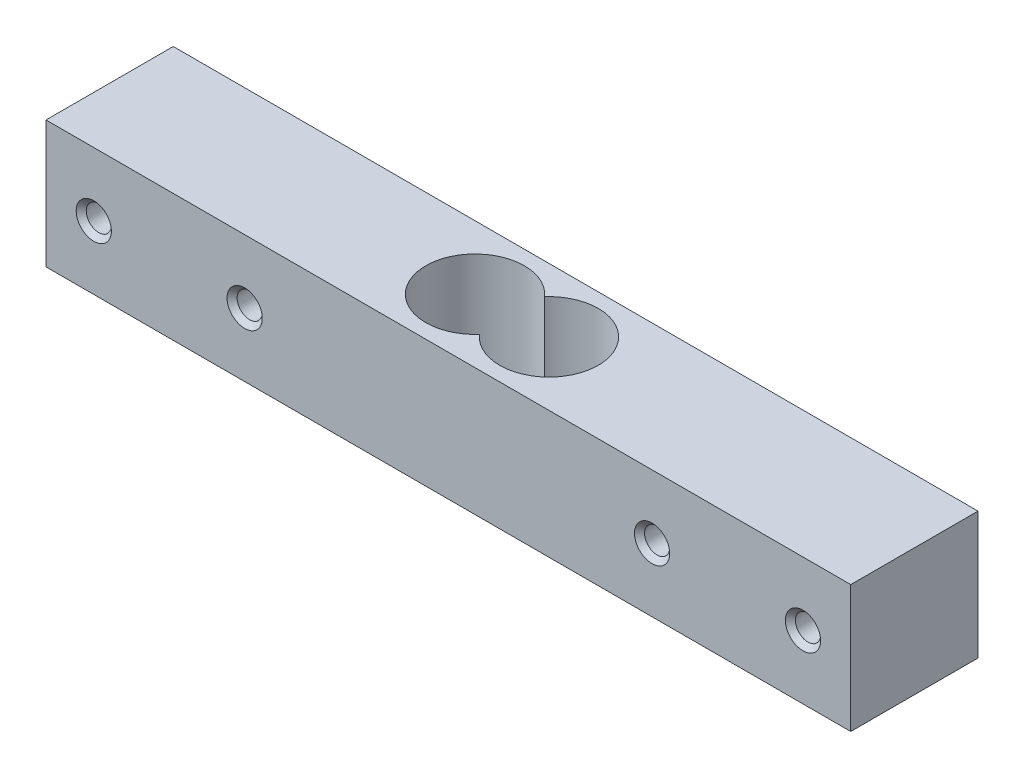
ISO-10303-21;
HEADER;
FILE_DESCRIPTION(('STEP AP214'),'2;1');
FILE_NAME('part.step','',(''),(''),'','','');
FILE_SCHEMA(('AUTOMOTIVE_DESIGN { 1 0 10303 214 1 1 1 1 }'));
ENDSEC;
DATA;
#1=APPLICATION_CONTEXT('core data for automotive mechanical design processes');
#2=APPLICATION_PROTOCOL_DEFINITION('international standard','automotive_design',2000,#1);
#3=PRODUCT_CONTEXT('',#1,'mechanical');
#4=PRODUCT('Part','Part','',(#3));
#5=PRODUCT_RELATED_PRODUCT_CATEGORY('part','',(#4));
#6=PRODUCT_DEFINITION_FORMATION('','',#4);
#7=PRODUCT_DEFINITION_CONTEXT('part definition',#1,'design');
#8=PRODUCT_DEFINITION('design','',#6,#7);
#9=PRODUCT_DEFINITION_SHAPE('','',#8);
#10=(LENGTH_UNIT() NAMED_UNIT(*) SI_UNIT(.MILLI.,.METRE.));
#11=(NAMED_UNIT(*) PLANE_ANGLE_UNIT() SI_UNIT($,.RADIAN.));
#12=(NAMED_UNIT(*) SI_UNIT($,.STERADIAN.) SOLID_ANGLE_UNIT());
#13=UNCERTAINTY_MEASURE_WITH_UNIT(LENGTH_MEASURE(1.E-05),#10,'distance_accuracy_value','');
#14=(GEOMETRIC_REPRESENTATION_CONTEXT(3) GLOBAL_UNCERTAINTY_ASSIGNED_CONTEXT((#13)) GLOBAL_UNIT_ASSIGNED_CONTEXT((#10,
#11,#12)) REPRESENTATION_CONTEXT('',''));
#15=CARTESIAN_POINT('',(0.,0.,0.));
#16=DIRECTION('',(0.,0.,1.));
#17=DIRECTION('',(1.,0.,0.));
#18=AXIS2_PLACEMENT_3D('',#15,#16,#17);
#19=CARTESIAN_POINT('',(0.,6.325,6.325));
#20=DIRECTION('',(0.,0.,-1.));
#21=DIRECTION('',(-1.,0.,0.));
#22=AXIS2_PLACEMENT_3D('',#19,#20,#21);
#23=PLANE('',#22);
#24=CARTESIAN_POINT('',(-35.25,0.,6.325));
#25=DIRECTION('',(0.,0.,-1.));
#26=DIRECTION('',(-1.,0.,0.));
#27=AXIS2_PLACEMENT_3D('',#24,#25,#26);
#28=CIRCLE('',#27,1.74999999999999);
#29=CARTESIAN_POINT('',(-37.,0.,6.325));
#30=VERTEX_POINT('',#29);
#31=EDGE_CURVE('E232',#30,#30,#28,.T.);
#32=ORIENTED_EDGE('',*,*,#31,.T.);
#33=EDGE_LOOP('',(#32));
#34=FACE_BOUND('',#33,.T.);
#35=CARTESIAN_POINT('',(-20.25,0.,6.325));
#36=DIRECTION('',(0.,0.,-1.));
#37=DIRECTION('',(-1.,0.,0.));
#38=AXIS2_PLACEMENT_3D('',#35,#36,#37);
#39=CIRCLE('',#38,1.75);
#40=CARTESIAN_POINT('',(-22.,0.,6.325));
#41=VERTEX_POINT('',#40);
#42=EDGE_CURVE('E244',#41,#41,#39,.T.);
#43=ORIENTED_EDGE('',*,*,#42,.T.);
#44=EDGE_LOOP('',(#43));
#45=FACE_BOUND('',#44,.T.);
#46=CARTESIAN_POINT('',(20.25,0.,6.325));
#47=DIRECTION('',(0.,0.,-1.));
#48=DIRECTION('',(-1.,0.,0.));
#49=AXIS2_PLACEMENT_3D('',#46,#47,#48);
#50=CIRCLE('',#49,1.75);
#51=CARTESIAN_POINT('',(18.5,0.,6.325));
#52=VERTEX_POINT('',#51);
#53=EDGE_CURVE('E257',#52,#52,#50,.T.);
#54=ORIENTED_EDGE('',*,*,#53,.T.);
#55=EDGE_LOOP('',(#54));
#56=FACE_BOUND('',#55,.T.);
#57=CARTESIAN_POINT('',(35.25,0.,6.325));
#58=DIRECTION('',(0.,0.,-1.));
#59=DIRECTION('',(-1.,0.,0.));
#60=AXIS2_PLACEMENT_3D('',#57,#58,#59);
#61=CIRCLE('',#60,1.74999999999999);
#62=CARTESIAN_POINT('',(33.5,0.,6.325));
#63=VERTEX_POINT('',#62);
#64=EDGE_CURVE('E212',#63,#63,#61,.T.);
#65=ORIENTED_EDGE('',*,*,#64,.T.);
#66=EDGE_LOOP('',(#65));
#67=FACE_BOUND('',#66,.T.);
#68=DIRECTION('',(1.,0.,0.));
#69=VECTOR('',#68,1.);
#70=CARTESIAN_POINT('',(0.,-6.325,6.325));
#71=LINE('',#70,#69);
#72=CARTESIAN_POINT('',(-40.,-6.325,6.325));
#73=VERTEX_POINT('',#72);
#74=CARTESIAN_POINT('',(40.,-6.325,6.325));
#75=VERTEX_POINT('',#74);
#76=EDGE_CURVE('E138',#73,#75,#71,.T.);
#77=ORIENTED_EDGE('',*,*,#76,.T.);
#78=DIRECTION('',(0.,-1.,0.));
#79=VECTOR('',#78,1.);
#80=CARTESIAN_POINT('',(40.,6.325,6.325));
#81=LINE('',#80,#79);
#82=CARTESIAN_POINT('',(40.,6.325,6.325));
#83=VERTEX_POINT('',#82);
#84=EDGE_CURVE('E11',#83,#75,#81,.T.);
#85=ORIENTED_EDGE('',*,*,#84,.F.);
#86=DIRECTION('',(1.,0.,0.));
#87=VECTOR('',#86,1.);
#88=CARTESIAN_POINT('',(0.,6.325,6.325));
#89=LINE('',#88,#87);
#90=CARTESIAN_POINT('',(-40.,6.325,6.325));
#91=VERTEX_POINT('',#90);
#92=EDGE_CURVE('E108',#91,#83,#89,.T.);
#93=ORIENTED_EDGE('',*,*,#92,.F.);
#94=DIRECTION('',(0.,-1.,0.));
#95=VECTOR('',#94,1.);
#96=CARTESIAN_POINT('',(-40.,6.325,6.325));
#97=LINE('',#96,#95);
#98=EDGE_CURVE('E60',#91,#73,#97,.T.);
#99=ORIENTED_EDGE('',*,*,#98,.T.);
#100=EDGE_LOOP('',(#77,#85,#93,#99));
#101=FACE_BOUND('',#100,.T.);
#102=ADVANCED_FACE('F40',(#34,#45,#56,#67,#101),#23,.F.);
#103=CARTESIAN_POINT('',(40.,6.325,0.));
#104=DIRECTION('',(-1.,0.,0.));
#105=DIRECTION('',(0.,0.,1.));
#106=AXIS2_PLACEMENT_3D('',#103,#104,#105);
#107=PLANE('',#106);
#108=DIRECTION('',(0.,0.,-1.));
#109=VECTOR('',#108,1.);
#110=CARTESIAN_POINT('',(40.,-6.325,0.));
#111=LINE('',#110,#109);
#112=CARTESIAN_POINT('',(40.,-6.325,-6.325));
#113=VERTEX_POINT('',#112);
#114=EDGE_CURVE('E115',#75,#113,#111,.T.);
#115=ORIENTED_EDGE('',*,*,#114,.T.);
#116=DIRECTION('',(0.,-1.,0.));
#117=VECTOR('',#116,1.);
#118=CARTESIAN_POINT('',(40.,6.325,-6.325));
#119=LINE('',#118,#117);
#120=CARTESIAN_POINT('',(40.,6.325,-6.325));
#121=VERTEX_POINT('',#120);
#122=EDGE_CURVE('E51',#121,#113,#119,.T.);
#123=ORIENTED_EDGE('',*,*,#122,.F.);
#124=DIRECTION('',(0.,0.,-1.));
#125=VECTOR('',#124,1.);
#126=CARTESIAN_POINT('',(40.,6.325,0.));
#127=LINE('',#126,#125);
#128=EDGE_CURVE('E102',#83,#121,#127,.T.);
#129=ORIENTED_EDGE('',*,*,#128,.F.);
#130=ORIENTED_EDGE('',*,*,#84,.T.);
#131=EDGE_LOOP('',(#115,#123,#129,#130));
#132=FACE_BOUND('',#131,.T.);
#133=ADVANCED_FACE('F114',(#132),#107,.F.);
#134=CARTESIAN_POINT('',(0.,6.325,-6.325));
#135=DIRECTION('',(0.,0.,-1.));
#136=DIRECTION('',(-1.,0.,0.));
#137=AXIS2_PLACEMENT_3D('',#134,#135,#136);
#138=PLANE('',#137);
#139=CARTESIAN_POINT('',(-35.25,0.,-6.325));
#140=DIRECTION('',(0.,0.,-1.));
#141=DIRECTION('',(-1.,0.,0.));
#142=AXIS2_PLACEMENT_3D('',#139,#140,#141);
#143=CIRCLE('',#142,1.75);
#144=CARTESIAN_POINT('',(-37.,0.,-6.325));
#145=VERTEX_POINT('',#144);
#146=EDGE_CURVE('E197',#145,#145,#143,.T.);
#147=ORIENTED_EDGE('',*,*,#146,.F.);
#148=EDGE_LOOP('',(#147));
#149=FACE_BOUND('',#148,.T.);
#150=CARTESIAN_POINT('',(-20.25,0.,-6.325));
#151=DIRECTION('',(0.,0.,-1.));
#152=DIRECTION('',(-1.,0.,0.));
#153=AXIS2_PLACEMENT_3D('',#150,#151,#152);
#154=CIRCLE('',#153,1.75);
#155=CARTESIAN_POINT('',(-22.,0.,-6.325));
#156=VERTEX_POINT('',#155);
#157=EDGE_CURVE('E201',#156,#156,#154,.T.);
#158=ORIENTED_EDGE('',*,*,#157,.F.);
#159=EDGE_LOOP('',(#158));
#160=FACE_BOUND('',#159,.T.);
#161=CARTESIAN_POINT('',(20.25,0.,-6.325));
#162=DIRECTION('',(0.,0.,-1.));
#163=DIRECTION('',(-1.,0.,0.));
#164=AXIS2_PLACEMENT_3D('',#161,#162,#163);
#165=CIRCLE('',#164,1.75);
#166=CARTESIAN_POINT('',(18.5,0.,-6.325));
#167=VERTEX_POINT('',#166);
#168=EDGE_CURVE('E205',#167,#167,#165,.T.);
#169=ORIENTED_EDGE('',*,*,#168,.F.);
#170=EDGE_LOOP('',(#169));
#171=FACE_BOUND('',#170,.T.);
#172=CARTESIAN_POINT('',(35.25,0.,-6.325));
#173=DIRECTION('',(0.,0.,-1.));
#174=DIRECTION('',(-1.,0.,0.));
#175=AXIS2_PLACEMENT_3D('',#172,#173,#174);
#176=CIRCLE('',#175,1.75);
#177=CARTESIAN_POINT('',(33.5,0.,-6.325));
#178=VERTEX_POINT('',#177);
#179=EDGE_CURVE('E208',#178,#178,#176,.T.);
#180=ORIENTED_EDGE('',*,*,#179,.F.);
#181=EDGE_LOOP('',(#180));
#182=FACE_BOUND('',#181,.T.);
#183=DIRECTION('',(1.,0.,0.));
#184=VECTOR('',#183,1.);
#185=CARTESIAN_POINT('',(0.,-6.325,-6.325));
#186=LINE('',#185,#184);
#187=CARTESIAN_POINT('',(-40.,-6.325,-6.325));
#188=VERTEX_POINT('',#187);
#189=EDGE_CURVE('E143',#188,#113,#186,.T.);
#190=ORIENTED_EDGE('',*,*,#189,.F.);
#191=DIRECTION('',(0.,-1.,0.));
#192=VECTOR('',#191,1.);
#193=CARTESIAN_POINT('',(-40.,6.325,-6.325));
#194=LINE('',#193,#192);
#195=CARTESIAN_POINT('',(-40.,6.325,-6.325));
#196=VERTEX_POINT('',#195);
#197=EDGE_CURVE('E80',#196,#188,#194,.T.);
#198=ORIENTED_EDGE('',*,*,#197,.F.);
#199=DIRECTION('',(1.,0.,0.));
#200=VECTOR('',#199,1.);
#201=CARTESIAN_POINT('',(0.,6.325,-6.325));
#202=LINE('',#201,#200);
#203=EDGE_CURVE('E107',#196,#121,#202,.T.);
#204=ORIENTED_EDGE('',*,*,#203,.T.);
#205=ORIENTED_EDGE('',*,*,#122,.T.);
#206=EDGE_LOOP('',(#190,#198,#204,#205));
#207=FACE_BOUND('',#206,.T.);
#208=ADVANCED_FACE('F120',(#149,#160,#171,#182,#207),#138,.T.);
#209=CARTESIAN_POINT('',(3.675,6.325,0.));
#210=DIRECTION('',(0.,-1.,0.));
#211=DIRECTION('',(0.,0.,-1.));
#212=AXIS2_PLACEMENT_3D('',#209,#210,#211);
#213=CYLINDRICAL_SURFACE('',#212,4.9);
#214=CARTESIAN_POINT('',(3.675,-6.325,0.));
#215=DIRECTION('',(0.,1.,0.));
#216=DIRECTION('',(0.,0.,1.));
#217=AXIS2_PLACEMENT_3D('',#214,#215,#216);
#218=CIRCLE('',#217,4.9);
#219=CARTESIAN_POINT('',(0.,-6.325,3.24104535605413));
#220=VERTEX_POINT('',#219);
#221=CARTESIAN_POINT('',(0.,-6.325,-3.24104535605413));
#222=VERTEX_POINT('',#221);
#223=EDGE_CURVE('E129',#220,#222,#218,.T.);
#224=ORIENTED_EDGE('',*,*,#223,.F.);
#225=DIRECTION('',(0.,-1.,0.));
#226=VECTOR('',#225,1.);
#227=CARTESIAN_POINT('',(0.,6.325,3.24104535605413));
#228=LINE('',#227,#226);
#229=CARTESIAN_POINT('',(0.,6.325,3.24104535605413));
#230=VERTEX_POINT('',#229);
#231=EDGE_CURVE('E44',#230,#220,#228,.T.);
#232=ORIENTED_EDGE('',*,*,#231,.F.);
#233=CARTESIAN_POINT('',(3.675,6.325,0.));
#234=DIRECTION('',(0.,1.,0.));
#235=DIRECTION('',(0.,0.,1.));
#236=AXIS2_PLACEMENT_3D('',#233,#234,#235);
#237=CIRCLE('',#236,4.9);
#238=CARTESIAN_POINT('',(0.,6.325,-3.24104535605413));
#239=VERTEX_POINT('',#238);
#240=EDGE_CURVE('E150',#230,#239,#237,.T.);
#241=ORIENTED_EDGE('',*,*,#240,.T.);
#242=DIRECTION('',(0.,-1.,0.));
#243=VECTOR('',#242,1.);
#244=CARTESIAN_POINT('',(0.,6.325,-3.24104535605413));
#245=LINE('',#244,#243);
#246=EDGE_CURVE('E125',#239,#222,#245,.T.);
#247=ORIENTED_EDGE('',*,*,#246,.T.);
#248=EDGE_LOOP('',(#224,#232,#241,#247));
#249=FACE_BOUND('',#248,.T.);
#250=ADVANCED_FACE('F42',(#249),#213,.F.);
#251=CARTESIAN_POINT('',(-3.675,6.325,0.));
#252=DIRECTION('',(0.,-1.,0.));
#253=DIRECTION('',(0.,0.,-1.));
#254=AXIS2_PLACEMENT_3D('',#251,#252,#253);
#255=CYLINDRICAL_SURFACE('',#254,4.9);
#256=CARTESIAN_POINT('',(-3.675,-6.325,0.));
#257=DIRECTION('',(0.,1.,0.));
#258=DIRECTION('',(0.,0.,1.));
#259=AXIS2_PLACEMENT_3D('',#256,#257,#258);
#260=CIRCLE('',#259,4.9);
#261=EDGE_CURVE('E133',#222,#220,#260,.T.);
#262=ORIENTED_EDGE('',*,*,#261,.F.);
#263=ORIENTED_EDGE('',*,*,#246,.F.);
#264=CARTESIAN_POINT('',(-3.675,6.325,0.));
#265=DIRECTION('',(0.,1.,0.));
#266=DIRECTION('',(0.,0.,1.));
#267=AXIS2_PLACEMENT_3D('',#264,#265,#266);
#268=CIRCLE('',#267,4.9);
#269=EDGE_CURVE('E163',#239,#230,#268,.T.);
#270=ORIENTED_EDGE('',*,*,#269,.T.);
#271=ORIENTED_EDGE('',*,*,#231,.T.);
#272=EDGE_LOOP('',(#262,#263,#270,#271));
#273=FACE_BOUND('',#272,.T.);
#274=ADVANCED_FACE('F161',(#273),#255,.F.);
#275=CARTESIAN_POINT('',(-40.,6.325,0.));
#276=DIRECTION('',(-1.,0.,0.));
#277=DIRECTION('',(0.,0.,1.));
#278=AXIS2_PLACEMENT_3D('',#275,#276,#277);
#279=PLANE('',#278);
#280=DIRECTION('',(0.,0.,-1.));
#281=VECTOR('',#280,1.);
#282=CARTESIAN_POINT('',(-40.,-6.325,0.));
#283=LINE('',#282,#281);
#284=EDGE_CURVE('E146',#73,#188,#283,.T.);
#285=ORIENTED_EDGE('',*,*,#284,.F.);
#286=ORIENTED_EDGE('',*,*,#98,.F.);
#287=DIRECTION('',(0.,0.,-1.));
#288=VECTOR('',#287,1.);
#289=CARTESIAN_POINT('',(-40.,6.325,0.));
#290=LINE('',#289,#288);
#291=EDGE_CURVE('E122',#91,#196,#290,.T.);
#292=ORIENTED_EDGE('',*,*,#291,.T.);
#293=ORIENTED_EDGE('',*,*,#197,.T.);
#294=EDGE_LOOP('',(#285,#286,#292,#293));
#295=FACE_BOUND('',#294,.T.);
#296=ADVANCED_FACE('F170',(#295),#279,.T.);
#297=CARTESIAN_POINT('',(0.,6.325,0.));
#298=DIRECTION('',(0.,1.,0.));
#299=DIRECTION('',(0.,0.,1.));
#300=AXIS2_PLACEMENT_3D('',#297,#298,#299);
#301=PLANE('',#300);
#302=ORIENTED_EDGE('',*,*,#240,.F.);
#303=ORIENTED_EDGE('',*,*,#269,.F.);
#304=EDGE_LOOP('',(#302,#303));
#305=FACE_BOUND('',#304,.T.);
#306=ORIENTED_EDGE('',*,*,#92,.T.);
#307=ORIENTED_EDGE('',*,*,#128,.T.);
#308=ORIENTED_EDGE('',*,*,#203,.F.);
#309=ORIENTED_EDGE('',*,*,#291,.F.);
#310=EDGE_LOOP('',(#306,#307,#308,#309));
#311=FACE_BOUND('',#310,.T.);
#312=ADVANCED_FACE('F104',(#305,#311),#301,.T.);
#313=CARTESIAN_POINT('',(0.,-6.325,0.));
#314=DIRECTION('',(0.,1.,0.));
#315=DIRECTION('',(0.,0.,1.));
#316=AXIS2_PLACEMENT_3D('',#313,#314,#315);
#317=PLANE('',#316);
#318=ORIENTED_EDGE('',*,*,#223,.T.);
#319=ORIENTED_EDGE('',*,*,#261,.T.);
#320=EDGE_LOOP('',(#318,#319));
#321=FACE_BOUND('',#320,.T.);
#322=ORIENTED_EDGE('',*,*,#76,.F.);
#323=ORIENTED_EDGE('',*,*,#284,.T.);
#324=ORIENTED_EDGE('',*,*,#189,.T.);
#325=ORIENTED_EDGE('',*,*,#114,.F.);
#326=EDGE_LOOP('',(#322,#323,#324,#325));
#327=FACE_BOUND('',#326,.T.);
#328=ADVANCED_FACE('F165',(#321,#327),#317,.F.);
#329=CARTESIAN_POINT('',(35.25,0.,5.825));
#330=DIRECTION('',(0.,0.,1.));
#331=DIRECTION('',(1.,0.,0.));
#332=AXIS2_PLACEMENT_3D('',#329,#330,#331);
#333=CONICAL_SURFACE('',#332,1.24999999999999,0.785398163397448);
#334=ORIENTED_EDGE('',*,*,#64,.F.);
#335=EDGE_LOOP('',(#334));
#336=FACE_BOUND('',#335,.T.);
#337=CARTESIAN_POINT('',(35.25,0.,5.825));
#338=DIRECTION('',(0.,0.,-1.));
#339=DIRECTION('',(-1.,0.,0.));
#340=AXIS2_PLACEMENT_3D('',#337,#338,#339);
#341=CIRCLE('',#340,1.24999999999999);
#342=CARTESIAN_POINT('',(34.,0.,5.825));
#343=VERTEX_POINT('',#342);
#344=EDGE_CURVE('E134',#343,#343,#341,.T.);
#345=ORIENTED_EDGE('',*,*,#344,.T.);
#346=EDGE_LOOP('',(#345));
#347=FACE_BOUND('',#346,.T.);
#348=ADVANCED_FACE('F168',(#336,#347),#333,.F.);
#349=CARTESIAN_POINT('',(35.25,0.,-6.325));
#350=DIRECTION('',(0.,0.,-1.));
#351=DIRECTION('',(-1.,0.,0.));
#352=AXIS2_PLACEMENT_3D('',#349,#350,#351);
#353=CYLINDRICAL_SURFACE('',#352,1.24999999999999);
#354=ORIENTED_EDGE('',*,*,#344,.F.);
#355=EDGE_LOOP('',(#354));
#356=FACE_BOUND('',#355,.T.);
#357=CARTESIAN_POINT('',(35.25,0.,-5.82499999999997));
#358=DIRECTION('',(0.,0.,-1.));
#359=DIRECTION('',(-1.,0.,0.));
#360=AXIS2_PLACEMENT_3D('',#357,#358,#359);
#361=CIRCLE('',#360,1.24999999999999);
#362=CARTESIAN_POINT('',(34.,0.,-5.82499999999997));
#363=VERTEX_POINT('',#362);
#364=EDGE_CURVE('E211',#363,#363,#361,.T.);
#365=ORIENTED_EDGE('',*,*,#364,.T.);
#366=EDGE_LOOP('',(#365));
#367=FACE_BOUND('',#366,.T.);
#368=ADVANCED_FACE('F297',(#356,#367),#353,.F.);
#369=CARTESIAN_POINT('',(35.25,0.,-6.325));
#370=DIRECTION('',(0.,0.,-1.));
#371=DIRECTION('',(-1.,0.,0.));
#372=AXIS2_PLACEMENT_3D('',#369,#370,#371);
#373=CONICAL_SURFACE('',#372,1.75,0.785398163397433);
#374=ORIENTED_EDGE('',*,*,#364,.F.);
#375=EDGE_LOOP('',(#374));
#376=FACE_BOUND('',#375,.T.);
#377=ORIENTED_EDGE('',*,*,#179,.T.);
#378=EDGE_LOOP('',(#377));
#379=FACE_BOUND('',#378,.T.);
#380=ADVANCED_FACE('F293',(#376,#379),#373,.F.);
#381=CARTESIAN_POINT('',(20.25,0.,5.825));
#382=DIRECTION('',(0.,0.,1.));
#383=DIRECTION('',(1.,0.,0.));
#384=AXIS2_PLACEMENT_3D('',#381,#382,#383);
#385=CONICAL_SURFACE('',#384,1.25,0.785398163397448);
#386=ORIENTED_EDGE('',*,*,#53,.F.);
#387=EDGE_LOOP('',(#386));
#388=FACE_BOUND('',#387,.T.);
#389=CARTESIAN_POINT('',(20.25,0.,5.825));
#390=DIRECTION('',(0.,0.,-1.));
#391=DIRECTION('',(-1.,0.,0.));
#392=AXIS2_PLACEMENT_3D('',#389,#390,#391);
#393=CIRCLE('',#392,1.25);
#394=CARTESIAN_POINT('',(19.,0.,5.825));
#395=VERTEX_POINT('',#394);
#396=EDGE_CURVE('E219',#395,#395,#393,.T.);
#397=ORIENTED_EDGE('',*,*,#396,.T.);
#398=EDGE_LOOP('',(#397));
#399=FACE_BOUND('',#398,.T.);
#400=ADVANCED_FACE('F270',(#388,#399),#385,.F.);
#401=CARTESIAN_POINT('',(20.25,0.,-6.325));
#402=DIRECTION('',(0.,0.,-1.));
#403=DIRECTION('',(-1.,0.,0.));
#404=AXIS2_PLACEMENT_3D('',#401,#402,#403);
#405=CYLINDRICAL_SURFACE('',#404,1.24999999999999);
#406=ORIENTED_EDGE('',*,*,#396,.F.);
#407=EDGE_LOOP('',(#406));
#408=FACE_BOUND('',#407,.T.);
#409=CARTESIAN_POINT('',(20.25,0.,-5.82499999999997));
#410=DIRECTION('',(0.,0.,-1.));
#411=DIRECTION('',(-1.,0.,0.));
#412=AXIS2_PLACEMENT_3D('',#409,#410,#411);
#413=CIRCLE('',#412,1.24999999999999);
#414=CARTESIAN_POINT('',(19.,0.,-5.82499999999997));
#415=VERTEX_POINT('',#414);
#416=EDGE_CURVE('E263',#415,#415,#413,.T.);
#417=ORIENTED_EDGE('',*,*,#416,.T.);
#418=EDGE_LOOP('',(#417));
#419=FACE_BOUND('',#418,.T.);
#420=ADVANCED_FACE('F272',(#408,#419),#405,.F.);
#421=CARTESIAN_POINT('',(20.25,0.,-6.325));
#422=DIRECTION('',(0.,0.,-1.));
#423=DIRECTION('',(-1.,0.,0.));
#424=AXIS2_PLACEMENT_3D('',#421,#422,#423);
#425=CONICAL_SURFACE('',#424,1.75,0.785398163397429);
#426=ORIENTED_EDGE('',*,*,#416,.F.);
#427=EDGE_LOOP('',(#426));
#428=FACE_BOUND('',#427,.T.);
#429=ORIENTED_EDGE('',*,*,#168,.T.);
#430=EDGE_LOOP('',(#429));
#431=FACE_BOUND('',#430,.T.);
#432=ADVANCED_FACE('F275',(#428,#431),#425,.F.);
#433=CARTESIAN_POINT('',(-20.25,0.,5.825));
#434=DIRECTION('',(0.,0.,1.));
#435=DIRECTION('',(1.,0.,0.));
#436=AXIS2_PLACEMENT_3D('',#433,#434,#435);
#437=CONICAL_SURFACE('',#436,1.25,0.785398163397448);
#438=ORIENTED_EDGE('',*,*,#42,.F.);
#439=EDGE_LOOP('',(#438));
#440=FACE_BOUND('',#439,.T.);
#441=CARTESIAN_POINT('',(-20.25,0.,5.825));
#442=DIRECTION('',(0.,0.,-1.));
#443=DIRECTION('',(-1.,0.,0.));
#444=AXIS2_PLACEMENT_3D('',#441,#442,#443);
#445=CIRCLE('',#444,1.25);
#446=CARTESIAN_POINT('',(-21.5,0.,5.825));
#447=VERTEX_POINT('',#446);
#448=EDGE_CURVE('E253',#447,#447,#445,.T.);
#449=ORIENTED_EDGE('',*,*,#448,.T.);
#450=EDGE_LOOP('',(#449));
#451=FACE_BOUND('',#450,.T.);
#452=ADVANCED_FACE('F281',(#440,#451),#437,.F.);
#453=CARTESIAN_POINT('',(-20.25,0.,-6.325));
#454=DIRECTION('',(0.,0.,-1.));
#455=DIRECTION('',(-1.,0.,0.));
#456=AXIS2_PLACEMENT_3D('',#453,#454,#455);
#457=CYLINDRICAL_SURFACE('',#456,1.24999999999999);
#458=ORIENTED_EDGE('',*,*,#448,.F.);
#459=EDGE_LOOP('',(#458));
#460=FACE_BOUND('',#459,.T.);
#461=CARTESIAN_POINT('',(-20.25,0.,-5.82499999999997));
#462=DIRECTION('',(0.,0.,-1.));
#463=DIRECTION('',(-1.,0.,0.));
#464=AXIS2_PLACEMENT_3D('',#461,#462,#463);
#465=CIRCLE('',#464,1.24999999999999);
#466=CARTESIAN_POINT('',(-21.5,0.,-5.82499999999997));
#467=VERTEX_POINT('',#466);
#468=EDGE_CURVE('E249',#467,#467,#465,.T.);
#469=ORIENTED_EDGE('',*,*,#468,.T.);
#470=EDGE_LOOP('',(#469));
#471=FACE_BOUND('',#470,.T.);
#472=ADVANCED_FACE('F286',(#460,#471),#457,.F.);
#473=CARTESIAN_POINT('',(-20.25,0.,-6.325));
#474=DIRECTION('',(0.,0.,-1.));
#475=DIRECTION('',(-1.,0.,0.));
#476=AXIS2_PLACEMENT_3D('',#473,#474,#475);
#477=CONICAL_SURFACE('',#476,1.75,0.785398163397429);
#478=ORIENTED_EDGE('',*,*,#468,.F.);
#479=EDGE_LOOP('',(#478));
#480=FACE_BOUND('',#479,.T.);
#481=ORIENTED_EDGE('',*,*,#157,.T.);
#482=EDGE_LOOP('',(#481));
#483=FACE_BOUND('',#482,.T.);
#484=ADVANCED_FACE('F342',(#480,#483),#477,.F.);
#485=CARTESIAN_POINT('',(-35.25,0.,5.825));
#486=DIRECTION('',(0.,0.,1.));
#487=DIRECTION('',(1.,0.,0.));
#488=AXIS2_PLACEMENT_3D('',#485,#486,#487);
#489=CONICAL_SURFACE('',#488,1.24999999999999,0.785398163397448);
#490=ORIENTED_EDGE('',*,*,#31,.F.);
#491=EDGE_LOOP('',(#490));
#492=FACE_BOUND('',#491,.T.);
#493=CARTESIAN_POINT('',(-35.25,0.,5.825));
#494=DIRECTION('',(0.,0.,-1.));
#495=DIRECTION('',(-1.,0.,0.));
#496=AXIS2_PLACEMENT_3D('',#493,#494,#495);
#497=CIRCLE('',#496,1.24999999999999);
#498=CARTESIAN_POINT('',(-36.5,0.,5.825));
#499=VERTEX_POINT('',#498);
#500=EDGE_CURVE('E240',#499,#499,#497,.T.);
#501=ORIENTED_EDGE('',*,*,#500,.T.);
#502=EDGE_LOOP('',(#501));
#503=FACE_BOUND('',#502,.T.);
#504=ADVANCED_FACE('F350',(#492,#503),#489,.F.);
#505=CARTESIAN_POINT('',(-35.25,0.,-6.325));
#506=DIRECTION('',(0.,0.,-1.));
#507=DIRECTION('',(-1.,0.,0.));
#508=AXIS2_PLACEMENT_3D('',#505,#506,#507);
#509=CYLINDRICAL_SURFACE('',#508,1.24999999999999);
#510=ORIENTED_EDGE('',*,*,#500,.F.);
#511=EDGE_LOOP('',(#510));
#512=FACE_BOUND('',#511,.T.);
#513=CARTESIAN_POINT('',(-35.25,0.,-5.82499999999997));
#514=DIRECTION('',(0.,0.,-1.));
#515=DIRECTION('',(-1.,0.,0.));
#516=AXIS2_PLACEMENT_3D('',#513,#514,#515);
#517=CIRCLE('',#516,1.24999999999999);
#518=CARTESIAN_POINT('',(-36.5,0.,-5.82499999999997));
#519=VERTEX_POINT('',#518);
#520=EDGE_CURVE('E231',#519,#519,#517,.T.);
#521=ORIENTED_EDGE('',*,*,#520,.T.);
#522=EDGE_LOOP('',(#521));
#523=FACE_BOUND('',#522,.T.);
#524=ADVANCED_FACE('F359',(#512,#523),#509,.F.);
#525=CARTESIAN_POINT('',(-35.25,0.,-6.325));
#526=DIRECTION('',(0.,0.,-1.));
#527=DIRECTION('',(-1.,0.,0.));
#528=AXIS2_PLACEMENT_3D('',#525,#526,#527);
#529=CONICAL_SURFACE('',#528,1.75,0.785398163397433);
#530=ORIENTED_EDGE('',*,*,#520,.F.);
#531=EDGE_LOOP('',(#530));
#532=FACE_BOUND('',#531,.T.);
#533=ORIENTED_EDGE('',*,*,#146,.T.);
#534=EDGE_LOOP('',(#533));
#535=FACE_BOUND('',#534,.T.);
#536=ADVANCED_FACE('F368',(#532,#535),#529,.F.);
#537=CLOSED_SHELL('',(#102,#133,#208,#250,#274,#296,#312,#328,#348,#368,#380,#400,#420,#432,
#452,#472,#484,#504,#524,#536));
#538=MANIFOLD_SOLID_BREP('B2',#537);
#539=ADVANCED_BREP_SHAPE_REPRESENTATION('',(#18,#538),#14);
#540=SHAPE_DEFINITION_REPRESENTATION(#9,#539);
ENDSEC;
END-ISO-10303-21;
